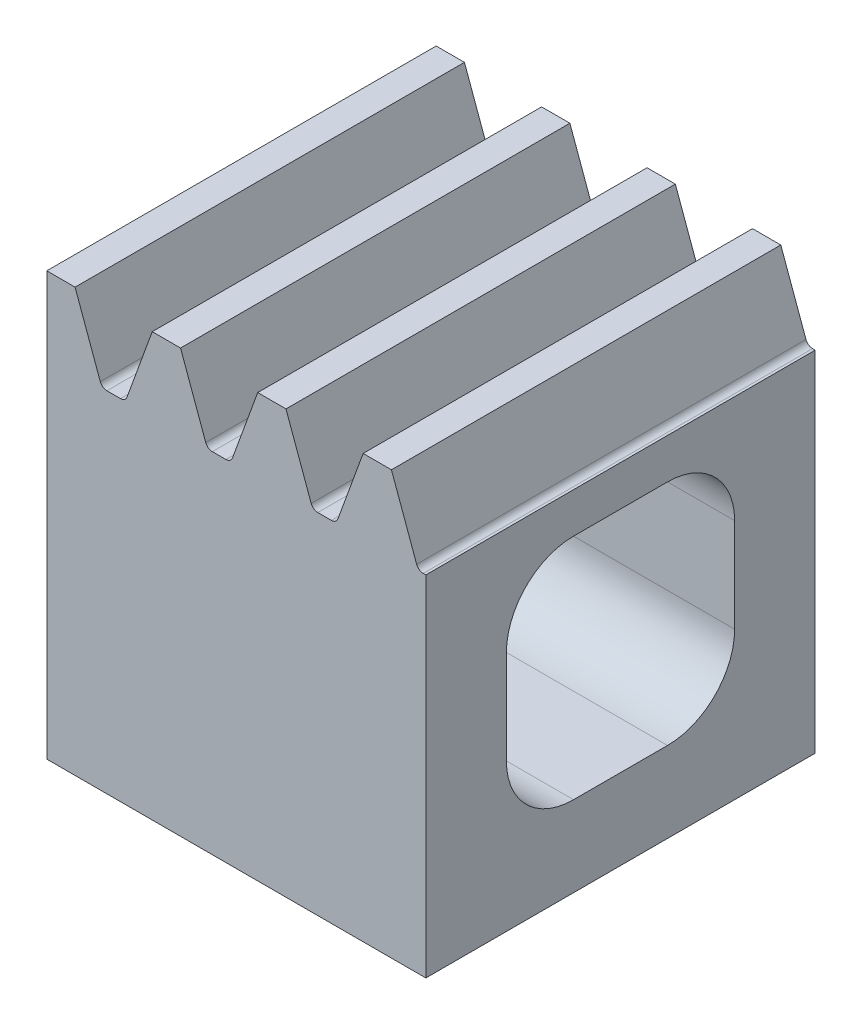
ISO-10303-21;
HEADER;
FILE_DESCRIPTION(('STEP AP214'),'2;1');
FILE_NAME('part.step','',(''),(''),'','','');
FILE_SCHEMA(('AUTOMOTIVE_DESIGN { 1 0 10303 214 1 1 1 1 }'));
ENDSEC;
DATA;
#1=APPLICATION_CONTEXT('core data for automotive mechanical design processes');
#2=APPLICATION_PROTOCOL_DEFINITION('international standard','automotive_design',2000,#1);
#3=PRODUCT_CONTEXT('',#1,'mechanical');
#4=PRODUCT('Part','Part','',(#3));
#5=PRODUCT_RELATED_PRODUCT_CATEGORY('part','',(#4));
#6=PRODUCT_DEFINITION_FORMATION('','',#4);
#7=PRODUCT_DEFINITION_CONTEXT('part definition',#1,'design');
#8=PRODUCT_DEFINITION('design','',#6,#7);
#9=PRODUCT_DEFINITION_SHAPE('','',#8);
#10=(LENGTH_UNIT() NAMED_UNIT(*) SI_UNIT(.MILLI.,.METRE.));
#11=(NAMED_UNIT(*) PLANE_ANGLE_UNIT() SI_UNIT($,.RADIAN.));
#12=(NAMED_UNIT(*) SI_UNIT($,.STERADIAN.) SOLID_ANGLE_UNIT());
#13=UNCERTAINTY_MEASURE_WITH_UNIT(LENGTH_MEASURE(1.E-05),#10,'distance_accuracy_value','');
#14=(GEOMETRIC_REPRESENTATION_CONTEXT(3) GLOBAL_UNCERTAINTY_ASSIGNED_CONTEXT((#13)) GLOBAL_UNIT_ASSIGNED_CONTEXT((#10,
#11,#12)) REPRESENTATION_CONTEXT('',''));
#15=CARTESIAN_POINT('',(0.,0.,0.));
#16=DIRECTION('',(0.,0.,1.));
#17=DIRECTION('',(1.,0.,0.));
#18=AXIS2_PLACEMENT_3D('',#15,#16,#17);
#19=CARTESIAN_POINT('',(125.,3.15,-2.));
#20=DIRECTION('',(0.,-1.,0.));
#21=DIRECTION('',(0.,0.,-1.));
#22=AXIS2_PLACEMENT_3D('',#19,#20,#21);
#23=PLANE('',#22);
#24=DIRECTION('',(0.,0.,1.));
#25=VECTOR('',#24,1.);
#26=CARTESIAN_POINT('',(-120.287615,3.15000000000001,-2.));
#27=LINE('',#26,#25);
#28=CARTESIAN_POINT('',(-120.287615,3.15000000000001,-2.));
#29=VERTEX_POINT('',#28);
#30=CARTESIAN_POINT('',(-120.287615,3.15000000000001,3.8));
#31=VERTEX_POINT('',#30);
#32=EDGE_CURVE('E511',#29,#31,#27,.T.);
#33=ORIENTED_EDGE('',*,*,#32,.T.);
#34=DIRECTION('',(-1.,0.,0.));
#35=VECTOR('',#34,1.);
#36=CARTESIAN_POINT('',(-119.866187734266,3.15000000000001,3.8));
#37=LINE('',#36,#35);
#38=CARTESIAN_POINT('',(-119.866187734266,3.15000000000001,3.8));
#39=VERTEX_POINT('',#38);
#40=EDGE_CURVE('E399',#39,#31,#37,.T.);
#41=ORIENTED_EDGE('',*,*,#40,.F.);
#42=DIRECTION('',(0.,0.,1.));
#43=VECTOR('',#42,1.);
#44=CARTESIAN_POINT('',(-119.866187734266,3.15000000000001,-2.));
#45=LINE('',#44,#43);
#46=CARTESIAN_POINT('',(-119.866187734266,3.15000000000001,-2.));
#47=VERTEX_POINT('',#46);
#48=EDGE_CURVE('E470',#47,#39,#45,.T.);
#49=ORIENTED_EDGE('',*,*,#48,.F.);
#50=DIRECTION('',(-1.,0.,0.));
#51=VECTOR('',#50,1.);
#52=CARTESIAN_POINT('',(125.,3.15,-2.));
#53=LINE('',#52,#51);
#54=EDGE_CURVE('E287',#47,#29,#53,.T.);
#55=ORIENTED_EDGE('',*,*,#54,.T.);
#56=EDGE_LOOP('',(#33,#41,#49,#55));
#57=FACE_BOUND('',#56,.T.);
#58=ADVANCED_FACE('F43',(#57),#23,.F.);
#59=DIRECTION('',(0.,0.,1.));
#60=VECTOR('',#59,1.);
#61=CARTESIAN_POINT('',(-121.85841,3.15000000000001,-2.));
#62=LINE('',#61,#60);
#63=CARTESIAN_POINT('',(-121.85841,3.15000000000001,-2.));
#64=VERTEX_POINT('',#63);
#65=CARTESIAN_POINT('',(-121.85841,3.15000000000001,3.8));
#66=VERTEX_POINT('',#65);
#67=EDGE_CURVE('E550',#64,#66,#62,.T.);
#68=ORIENTED_EDGE('',*,*,#67,.T.);
#69=DIRECTION('',(-1.,0.,0.));
#70=VECTOR('',#69,1.);
#71=CARTESIAN_POINT('',(-121.436982734266,3.15000000000001,3.8));
#72=LINE('',#71,#70);
#73=CARTESIAN_POINT('',(-121.436982734266,3.15000000000001,3.8));
#74=VERTEX_POINT('',#73);
#75=EDGE_CURVE('E417',#74,#66,#72,.T.);
#76=ORIENTED_EDGE('',*,*,#75,.F.);
#77=DIRECTION('',(0.,0.,1.));
#78=VECTOR('',#77,1.);
#79=CARTESIAN_POINT('',(-121.436982734266,3.15000000000001,-2.));
#80=LINE('',#79,#78);
#81=CARTESIAN_POINT('',(-121.436982734266,3.15000000000001,-2.));
#82=VERTEX_POINT('',#81);
#83=EDGE_CURVE('E490',#82,#74,#80,.T.);
#84=ORIENTED_EDGE('',*,*,#83,.F.);
#85=EDGE_CURVE('E295',#82,#64,#53,.T.);
#86=ORIENTED_EDGE('',*,*,#85,.T.);
#87=EDGE_LOOP('',(#68,#76,#84,#86));
#88=FACE_BOUND('',#87,.T.);
#89=ADVANCED_FACE('F663',(#88),#23,.F.);
#90=DIRECTION('',(0.,0.,1.));
#91=VECTOR('',#90,1.);
#92=CARTESIAN_POINT('',(-123.429205,3.15000000000001,-2.));
#93=LINE('',#92,#91);
#94=CARTESIAN_POINT('',(-123.429205,3.15000000000001,-2.));
#95=VERTEX_POINT('',#94);
#96=CARTESIAN_POINT('',(-123.429205,3.15000000000001,3.8));
#97=VERTEX_POINT('',#96);
#98=EDGE_CURVE('E566',#95,#97,#93,.T.);
#99=ORIENTED_EDGE('',*,*,#98,.T.);
#100=DIRECTION('',(-1.,0.,0.));
#101=VECTOR('',#100,1.);
#102=CARTESIAN_POINT('',(-123.007777734266,3.15000000000001,3.8));
#103=LINE('',#102,#101);
#104=CARTESIAN_POINT('',(-123.007777734266,3.15000000000001,3.8));
#105=VERTEX_POINT('',#104);
#106=EDGE_CURVE('E435',#105,#97,#103,.T.);
#107=ORIENTED_EDGE('',*,*,#106,.F.);
#108=DIRECTION('',(0.,0.,1.));
#109=VECTOR('',#108,1.);
#110=CARTESIAN_POINT('',(-123.007777734266,3.15000000000001,-2.));
#111=LINE('',#110,#109);
#112=CARTESIAN_POINT('',(-123.007777734266,3.15000000000001,-2.));
#113=VERTEX_POINT('',#112);
#114=EDGE_CURVE('E529',#113,#105,#111,.T.);
#115=ORIENTED_EDGE('',*,*,#114,.F.);
#116=EDGE_CURVE('E285',#113,#95,#53,.T.);
#117=ORIENTED_EDGE('',*,*,#116,.T.);
#118=EDGE_LOOP('',(#99,#107,#115,#117));
#119=FACE_BOUND('',#118,.T.);
#120=ADVANCED_FACE('F630',(#119),#23,.F.);
#121=CARTESIAN_POINT('',(125.,-3.15,-2.));
#122=DIRECTION('',(0.,0.,1.));
#123=DIRECTION('',(1.,0.,0.));
#124=AXIS2_PLACEMENT_3D('',#121,#122,#123);
#125=PLANE('',#124);
#126=DIRECTION('',(1.,0.,0.));
#127=VECTOR('',#126,1.);
#128=CARTESIAN_POINT('',(-119.465820476573,2.05,-2.));
#129=LINE('',#128,#127);
#130=CARTESIAN_POINT('',(-119.392585794194,2.05,-2.));
#131=VERTEX_POINT('',#130);
#132=CARTESIAN_POINT('',(-119.353616507946,2.05,-2.));
#133=VERTEX_POINT('',#132);
#134=EDGE_CURVE('E274',#131,#133,#129,.T.);
#135=ORIENTED_EDGE('',*,*,#134,.T.);
#136=DIRECTION('',(0.,1.,0.));
#137=VECTOR('',#136,1.);
#138=CARTESIAN_POINT('',(-119.353616507946,11.9079885195628,-2.));
#139=LINE('',#138,#137);
#140=CARTESIAN_POINT('',(-119.353616507946,-3.15,-2.));
#141=VERTEX_POINT('',#140);
#142=EDGE_CURVE('E258',#141,#133,#139,.T.);
#143=ORIENTED_EDGE('',*,*,#142,.F.);
#144=DIRECTION('',(-1.,0.,0.));
#145=VECTOR('',#144,1.);
#146=CARTESIAN_POINT('',(125.,-3.15,-2.));
#147=LINE('',#146,#145);
#148=CARTESIAN_POINT('',(-125.,-3.15,-2.));
#149=VERTEX_POINT('',#148);
#150=EDGE_CURVE('E270',#141,#149,#147,.T.);
#151=ORIENTED_EDGE('',*,*,#150,.T.);
#152=DIRECTION('',(0.,1.,0.));
#153=VECTOR('',#152,1.);
#154=CARTESIAN_POINT('',(-125.,-3.15,-2.));
#155=LINE('',#154,#153);
#156=CARTESIAN_POINT('',(-125.,3.15,-2.));
#157=VERTEX_POINT('',#156);
#158=EDGE_CURVE('E569',#149,#157,#155,.T.);
#159=ORIENTED_EDGE('',*,*,#158,.T.);
#160=CARTESIAN_POINT('',(-124.578572734266,3.15000000000001,-2.));
#161=VERTEX_POINT('',#160);
#162=EDGE_CURVE('E280',#161,#157,#53,.T.);
#163=ORIENTED_EDGE('',*,*,#162,.F.);
#164=DIRECTION('',(0.342020143325668,-0.939692620785909,0.));
#165=VECTOR('',#164,1.);
#166=CARTESIAN_POINT('',(-124.578572734266,3.15000000000001,-2.));
#167=LINE('',#166,#165);
#168=CARTESIAN_POINT('',(-124.203253213137,2.11881809061729,-2.));
#169=VERTEX_POINT('',#168);
#170=EDGE_CURVE('E553',#161,#169,#167,.T.);
#171=ORIENTED_EDGE('',*,*,#170,.T.);
#172=CARTESIAN_POINT('',(-124.104970794194,2.15458996566418,-2.));
#173=DIRECTION('',(0.,0.,1.));
#174=DIRECTION('',(1.,0.,0.));
#175=AXIS2_PLACEMENT_3D('',#172,#173,#174);
#176=CIRCLE('',#175,0.104589965664178);
#177=CARTESIAN_POINT('',(-124.104970794194,2.05,-2.));
#178=VERTEX_POINT('',#177);
#179=EDGE_CURVE('E310',#169,#178,#176,.T.);
#180=ORIENTED_EDGE('',*,*,#179,.T.);
#181=DIRECTION('',(1.,0.,0.));
#182=VECTOR('',#181,1.);
#183=CARTESIAN_POINT('',(-124.178205476573,2.05,-2.));
#184=LINE('',#183,#182);
#185=CARTESIAN_POINT('',(-123.902806940072,2.05,-2.));
#186=VERTEX_POINT('',#185);
#187=EDGE_CURVE('E557',#178,#186,#184,.T.);
#188=ORIENTED_EDGE('',*,*,#187,.T.);
#189=CARTESIAN_POINT('',(-123.902806940072,2.15458996566418,-2.));
#190=DIRECTION('',(0.,0.,1.));
#191=DIRECTION('',(1.,0.,0.));
#192=AXIS2_PLACEMENT_3D('',#189,#190,#191);
#193=CIRCLE('',#192,0.104589965664178);
#194=CARTESIAN_POINT('',(-123.804524521129,2.11881809061729,-2.));
#195=VERTEX_POINT('',#194);
#196=EDGE_CURVE('E307',#186,#195,#193,.T.);
#197=ORIENTED_EDGE('',*,*,#196,.T.);
#198=DIRECTION('',(0.342020143325668,0.939692620785909,0.));
#199=VECTOR('',#198,1.);
#200=CARTESIAN_POINT('',(-123.829572257693,2.05,-2.));
#201=LINE('',#200,#199);
#202=EDGE_CURVE('E561',#195,#95,#201,.T.);
#203=ORIENTED_EDGE('',*,*,#202,.T.);
#204=ORIENTED_EDGE('',*,*,#116,.F.);
#205=DIRECTION('',(0.342020143325668,-0.939692620785909,0.));
#206=VECTOR('',#205,1.);
#207=CARTESIAN_POINT('',(-123.007777734266,3.15000000000001,-2.));
#208=LINE('',#207,#206);
#209=CARTESIAN_POINT('',(-122.632458213137,2.11881809061729,-2.));
#210=VERTEX_POINT('',#209);
#211=EDGE_CURVE('E525',#113,#210,#208,.T.);
#212=ORIENTED_EDGE('',*,*,#211,.T.);
#213=CARTESIAN_POINT('',(-122.534175794194,2.15458996566418,-2.));
#214=DIRECTION('',(0.,0.,1.));
#215=DIRECTION('',(1.,0.,0.));
#216=AXIS2_PLACEMENT_3D('',#213,#214,#215);
#217=CIRCLE('',#216,0.104589965664178);
#218=CARTESIAN_POINT('',(-122.534175794194,2.05,-2.));
#219=VERTEX_POINT('',#218);
#220=EDGE_CURVE('E514',#210,#219,#217,.T.);
#221=ORIENTED_EDGE('',*,*,#220,.T.);
#222=DIRECTION('',(1.,0.,0.));
#223=VECTOR('',#222,1.);
#224=CARTESIAN_POINT('',(-122.607410476573,2.05,-2.));
#225=LINE('',#224,#223);
#226=CARTESIAN_POINT('',(-122.332011940072,2.05,-2.));
#227=VERTEX_POINT('',#226);
#228=EDGE_CURVE('E535',#219,#227,#225,.T.);
#229=ORIENTED_EDGE('',*,*,#228,.T.);
#230=CARTESIAN_POINT('',(-122.332011940072,2.15458996566418,-2.));
#231=DIRECTION('',(0.,0.,1.));
#232=DIRECTION('',(1.,0.,0.));
#233=AXIS2_PLACEMENT_3D('',#230,#231,#232);
#234=CIRCLE('',#233,0.104589965664178);
#235=CARTESIAN_POINT('',(-122.233729521129,2.11881809061729,-2.));
#236=VERTEX_POINT('',#235);
#237=EDGE_CURVE('E539',#227,#236,#234,.T.);
#238=ORIENTED_EDGE('',*,*,#237,.T.);
#239=DIRECTION('',(0.342020143325668,0.939692620785909,0.));
#240=VECTOR('',#239,1.);
#241=CARTESIAN_POINT('',(-122.258777257693,2.05,-2.));
#242=LINE('',#241,#240);
#243=EDGE_CURVE('E546',#236,#64,#242,.T.);
#244=ORIENTED_EDGE('',*,*,#243,.T.);
#245=ORIENTED_EDGE('',*,*,#85,.F.);
#246=DIRECTION('',(0.342020143325668,-0.939692620785909,0.));
#247=VECTOR('',#246,1.);
#248=CARTESIAN_POINT('',(-121.436982734266,3.15000000000001,-2.));
#249=LINE('',#248,#247);
#250=CARTESIAN_POINT('',(-121.061663213137,2.11881809061729,-2.));
#251=VERTEX_POINT('',#250);
#252=EDGE_CURVE('E486',#82,#251,#249,.T.);
#253=ORIENTED_EDGE('',*,*,#252,.T.);
#254=CARTESIAN_POINT('',(-120.963380794194,2.15458996566418,-2.));
#255=DIRECTION('',(0.,0.,1.));
#256=DIRECTION('',(1.,0.,0.));
#257=AXIS2_PLACEMENT_3D('',#254,#255,#256);
#258=CIRCLE('',#257,0.104589965664178);
#259=CARTESIAN_POINT('',(-120.963380794194,2.05,-2.));
#260=VERTEX_POINT('',#259);
#261=EDGE_CURVE('E475',#251,#260,#258,.T.);
#262=ORIENTED_EDGE('',*,*,#261,.T.);
#263=DIRECTION('',(1.,0.,0.));
#264=VECTOR('',#263,1.);
#265=CARTESIAN_POINT('',(-121.036615476573,2.05,-2.));
#266=LINE('',#265,#264);
#267=CARTESIAN_POINT('',(-120.761216940072,2.05,-2.));
#268=VERTEX_POINT('',#267);
#269=EDGE_CURVE('E496',#260,#268,#266,.T.);
#270=ORIENTED_EDGE('',*,*,#269,.T.);
#271=CARTESIAN_POINT('',(-120.761216940072,2.15458996566418,-2.));
#272=DIRECTION('',(0.,0.,1.));
#273=DIRECTION('',(1.,0.,0.));
#274=AXIS2_PLACEMENT_3D('',#271,#272,#273);
#275=CIRCLE('',#274,0.104589965664178);
#276=CARTESIAN_POINT('',(-120.662934521129,2.11881809061729,-2.));
#277=VERTEX_POINT('',#276);
#278=EDGE_CURVE('E500',#268,#277,#275,.T.);
#279=ORIENTED_EDGE('',*,*,#278,.T.);
#280=DIRECTION('',(0.342020143325668,0.939692620785909,0.));
#281=VECTOR('',#280,1.);
#282=CARTESIAN_POINT('',(-120.687982257693,2.05,-2.));
#283=LINE('',#282,#281);
#284=EDGE_CURVE('E507',#277,#29,#283,.T.);
#285=ORIENTED_EDGE('',*,*,#284,.T.);
#286=ORIENTED_EDGE('',*,*,#54,.F.);
#287=DIRECTION('',(0.342020143325668,-0.939692620785909,0.));
#288=VECTOR('',#287,1.);
#289=CARTESIAN_POINT('',(-119.866187734266,3.15000000000001,-2.));
#290=LINE('',#289,#288);
#291=CARTESIAN_POINT('',(-119.490868213137,2.11881809061729,-2.));
#292=VERTEX_POINT('',#291);
#293=EDGE_CURVE('E466',#47,#292,#290,.T.);
#294=ORIENTED_EDGE('',*,*,#293,.T.);
#295=CARTESIAN_POINT('',(-119.392585794194,2.15458996566418,-2.));
#296=DIRECTION('',(0.,0.,1.));
#297=DIRECTION('',(1.,0.,0.));
#298=AXIS2_PLACEMENT_3D('',#295,#296,#297);
#299=CIRCLE('',#298,0.104589965664178);
#300=EDGE_CURVE('E456',#292,#131,#299,.T.);
#301=ORIENTED_EDGE('',*,*,#300,.T.);
#302=EDGE_LOOP('',(#135,#143,#151,#159,#163,#171,#180,#188,#197,#203,#204,#212,#221,#229,#238,
#244,#245,#253,#262,#270,#279,#285,#286,#294,#301));
#303=FACE_BOUND('',#302,.T.);
#304=ADVANCED_FACE('F268',(#303),#125,.F.);
#305=DIRECTION('',(0.,0.,1.));
#306=VECTOR('',#305,1.);
#307=CARTESIAN_POINT('',(-125.,3.15,-2.));
#308=LINE('',#307,#306);
#309=CARTESIAN_POINT('',(-125.,3.15,3.8));
#310=VERTEX_POINT('',#309);
#311=EDGE_CURVE('E289',#157,#310,#308,.T.);
#312=ORIENTED_EDGE('',*,*,#311,.T.);
#313=DIRECTION('',(-1.,0.,0.));
#314=VECTOR('',#313,1.);
#315=CARTESIAN_POINT('',(-124.578572734266,3.15000000000001,3.8));
#316=LINE('',#315,#314);
#317=CARTESIAN_POINT('',(-124.578572734266,3.15000000000001,3.8));
#318=VERTEX_POINT('',#317);
#319=EDGE_CURVE('E453',#318,#310,#316,.T.);
#320=ORIENTED_EDGE('',*,*,#319,.F.);
#321=DIRECTION('',(0.,0.,1.));
#322=VECTOR('',#321,1.);
#323=CARTESIAN_POINT('',(-124.578572734266,3.15000000000001,-2.));
#324=LINE('',#323,#322);
#325=EDGE_CURVE('E565',#161,#318,#324,.T.);
#326=ORIENTED_EDGE('',*,*,#325,.F.);
#327=ORIENTED_EDGE('',*,*,#162,.T.);
#328=EDGE_LOOP('',(#312,#320,#326,#327));
#329=FACE_BOUND('',#328,.T.);
#330=ADVANCED_FACE('F578',(#329),#23,.F.);
#331=CARTESIAN_POINT('',(125.,-3.15,2.));
#332=DIRECTION('',(0.,1.,0.));
#333=DIRECTION('',(0.,0.,1.));
#334=AXIS2_PLACEMENT_3D('',#331,#332,#333);
#335=PLANE('',#334);
#336=ORIENTED_EDGE('',*,*,#150,.F.);
#337=DIRECTION('',(0.,0.,1.));
#338=VECTOR('',#337,1.);
#339=CARTESIAN_POINT('',(-119.353616507946,-3.15,2.));
#340=LINE('',#339,#338);
#341=CARTESIAN_POINT('',(-119.353616507946,-3.15,3.8));
#342=VERTEX_POINT('',#341);
#343=EDGE_CURVE('E255',#141,#342,#340,.T.);
#344=ORIENTED_EDGE('',*,*,#343,.T.);
#345=DIRECTION('',(1.,0.,0.));
#346=VECTOR('',#345,1.);
#347=CARTESIAN_POINT('',(-125.,-3.15,3.8));
#348=LINE('',#347,#346);
#349=CARTESIAN_POINT('',(-125.,-3.15,3.8));
#350=VERTEX_POINT('',#349);
#351=EDGE_CURVE('E389',#350,#342,#348,.T.);
#352=ORIENTED_EDGE('',*,*,#351,.F.);
#353=DIRECTION('',(0.,0.,-1.));
#354=VECTOR('',#353,1.);
#355=CARTESIAN_POINT('',(-125.,-3.15,2.));
#356=LINE('',#355,#354);
#357=EDGE_CURVE('E278',#350,#149,#356,.T.);
#358=ORIENTED_EDGE('',*,*,#357,.T.);
#359=EDGE_LOOP('',(#336,#344,#352,#358));
#360=FACE_BOUND('',#359,.T.);
#361=ADVANCED_FACE('F277',(#360),#335,.F.);
#362=CARTESIAN_POINT('',(-125.,0.,0.));
#363=DIRECTION('',(1.,0.,0.));
#364=DIRECTION('',(0.,0.,-1.));
#365=AXIS2_PLACEMENT_3D('',#362,#363,#364);
#366=PLANE('',#365);
#367=DIRECTION('',(0.,1.,0.));
#368=VECTOR('',#367,1.);
#369=CARTESIAN_POINT('',(-125.,1.45,2.6));
#370=LINE('',#369,#368);
#371=CARTESIAN_POINT('',(-125.,-0.949999999999998,2.6));
#372=VERTEX_POINT('',#371);
#373=CARTESIAN_POINT('',(-125.,0.450000000000001,2.6));
#374=VERTEX_POINT('',#373);
#375=EDGE_CURVE('E345',#372,#374,#370,.T.);
#376=ORIENTED_EDGE('',*,*,#375,.F.);
#377=CARTESIAN_POINT('',(-125.,-0.949999999999998,1.6));
#378=DIRECTION('',(1.,0.,0.));
#379=DIRECTION('',(0.,0.,-1.));
#380=AXIS2_PLACEMENT_3D('',#377,#378,#379);
#381=CIRCLE('',#380,1.);
#382=CARTESIAN_POINT('',(-125.,-1.95,1.6));
#383=VERTEX_POINT('',#382);
#384=EDGE_CURVE('E337',#372,#383,#381,.T.);
#385=ORIENTED_EDGE('',*,*,#384,.T.);
#386=DIRECTION('',(0.,0.,1.));
#387=VECTOR('',#386,1.);
#388=CARTESIAN_POINT('',(-125.,-1.95,2.6));
#389=LINE('',#388,#387);
#390=CARTESIAN_POINT('',(-125.,-1.95,0.200000000000001));
#391=VERTEX_POINT('',#390);
#392=EDGE_CURVE('E264',#391,#383,#389,.T.);
#393=ORIENTED_EDGE('',*,*,#392,.F.);
#394=CARTESIAN_POINT('',(-125.,-0.949999999999999,0.200000000000001));
#395=DIRECTION('',(1.,0.,0.));
#396=DIRECTION('',(0.,0.,-1.));
#397=AXIS2_PLACEMENT_3D('',#394,#395,#396);
#398=CIRCLE('',#397,1.);
#399=CARTESIAN_POINT('',(-125.,-0.949999999999999,-0.799999999999999));
#400=VERTEX_POINT('',#399);
#401=EDGE_CURVE('E333',#391,#400,#398,.T.);
#402=ORIENTED_EDGE('',*,*,#401,.T.);
#403=DIRECTION('',(0.,-1.,0.));
#404=VECTOR('',#403,1.);
#405=CARTESIAN_POINT('',(-125.,-1.95,-0.799999999999999));
#406=LINE('',#405,#404);
#407=CARTESIAN_POINT('',(-125.,0.450000000000001,-0.799999999999999));
#408=VERTEX_POINT('',#407);
#409=EDGE_CURVE('E383',#408,#400,#406,.T.);
#410=ORIENTED_EDGE('',*,*,#409,.F.);
#411=CARTESIAN_POINT('',(-125.,0.450000000000001,0.200000000000001));
#412=DIRECTION('',(1.,0.,0.));
#413=DIRECTION('',(0.,0.,-1.));
#414=AXIS2_PLACEMENT_3D('',#411,#412,#413);
#415=CIRCLE('',#414,1.);
#416=CARTESIAN_POINT('',(-125.,1.45,0.200000000000001));
#417=VERTEX_POINT('',#416);
#418=EDGE_CURVE('E335',#408,#417,#415,.T.);
#419=ORIENTED_EDGE('',*,*,#418,.T.);
#420=DIRECTION('',(0.,0.,-1.));
#421=VECTOR('',#420,1.);
#422=CARTESIAN_POINT('',(-125.,1.45,-0.799999999999999));
#423=LINE('',#422,#421);
#424=CARTESIAN_POINT('',(-125.,1.45,1.6));
#425=VERTEX_POINT('',#424);
#426=EDGE_CURVE('E347',#425,#417,#423,.T.);
#427=ORIENTED_EDGE('',*,*,#426,.F.);
#428=CARTESIAN_POINT('',(-125.,0.450000000000001,1.6));
#429=DIRECTION('',(1.,0.,0.));
#430=DIRECTION('',(0.,0.,-1.));
#431=AXIS2_PLACEMENT_3D('',#428,#429,#430);
#432=CIRCLE('',#431,1.);
#433=EDGE_CURVE('E51',#425,#374,#432,.T.);
#434=ORIENTED_EDGE('',*,*,#433,.T.);
#435=EDGE_LOOP('',(#376,#385,#393,#402,#410,#419,#427,#434));
#436=FACE_BOUND('',#435,.T.);
#437=ORIENTED_EDGE('',*,*,#158,.F.);
#438=ORIENTED_EDGE('',*,*,#357,.F.);
#439=DIRECTION('',(0.,-1.,0.));
#440=VECTOR('',#439,1.);
#441=CARTESIAN_POINT('',(-125.,3.15,3.8));
#442=LINE('',#441,#440);
#443=EDGE_CURVE('E386',#310,#350,#442,.T.);
#444=ORIENTED_EDGE('',*,*,#443,.F.);
#445=ORIENTED_EDGE('',*,*,#311,.F.);
#446=EDGE_LOOP('',(#437,#438,#444,#445));
#447=FACE_BOUND('',#446,.T.);
#448=ADVANCED_FACE('F343',(#436,#447),#366,.F.);
#449=CARTESIAN_POINT('',(-123.829572257693,2.05,-2.));
#450=DIRECTION('',(0.939692620785909,-0.342020143325668,0.));
#451=DIRECTION('',(0.342020143325668,0.939692620785909,0.));
#452=AXIS2_PLACEMENT_3D('',#449,#450,#451);
#453=PLANE('',#452);
#454=ORIENTED_EDGE('',*,*,#202,.F.);
#455=DIRECTION('',(0.,0.,1.));
#456=VECTOR('',#455,1.);
#457=CARTESIAN_POINT('',(-123.804524521129,2.11881809061729,2.));
#458=LINE('',#457,#456);
#459=CARTESIAN_POINT('',(-123.804524521129,2.11881809061729,3.8));
#460=VERTEX_POINT('',#459);
#461=EDGE_CURVE('E294',#195,#460,#458,.T.);
#462=ORIENTED_EDGE('',*,*,#461,.T.);
#463=DIRECTION('',(-0.342020143325668,-0.939692620785909,0.));
#464=VECTOR('',#463,1.);
#465=CARTESIAN_POINT('',(-123.429205,3.15000000000001,3.8));
#466=LINE('',#465,#464);
#467=EDGE_CURVE('E438',#97,#460,#466,.T.);
#468=ORIENTED_EDGE('',*,*,#467,.F.);
#469=ORIENTED_EDGE('',*,*,#98,.F.);
#470=EDGE_LOOP('',(#454,#462,#468,#469));
#471=FACE_BOUND('',#470,.T.);
#472=ADVANCED_FACE('F638',(#471),#453,.F.);
#473=CARTESIAN_POINT('',(-124.178205476573,2.05,-2.));
#474=DIRECTION('',(0.,-1.,0.));
#475=DIRECTION('',(0.,0.,-1.));
#476=AXIS2_PLACEMENT_3D('',#473,#474,#475);
#477=PLANE('',#476);
#478=DIRECTION('',(0.,0.,1.));
#479=VECTOR('',#478,1.);
#480=CARTESIAN_POINT('',(-124.104970794194,2.05,2.));
#481=LINE('',#480,#479);
#482=CARTESIAN_POINT('',(-124.104970794194,2.05,3.8));
#483=VERTEX_POINT('',#482);
#484=EDGE_CURVE('E298',#178,#483,#481,.T.);
#485=ORIENTED_EDGE('',*,*,#484,.T.);
#486=DIRECTION('',(-1.,0.,0.));
#487=VECTOR('',#486,1.);
#488=CARTESIAN_POINT('',(-123.902806940072,2.05,3.8));
#489=LINE('',#488,#487);
#490=CARTESIAN_POINT('',(-123.902806940072,2.05,3.8));
#491=VERTEX_POINT('',#490);
#492=EDGE_CURVE('E444',#491,#483,#489,.T.);
#493=ORIENTED_EDGE('',*,*,#492,.F.);
#494=DIRECTION('',(0.,0.,1.));
#495=VECTOR('',#494,1.);
#496=CARTESIAN_POINT('',(-123.902806940072,2.05,-2.));
#497=LINE('',#496,#495);
#498=EDGE_CURVE('E301',#491,#186,#497,.F.);
#499=ORIENTED_EDGE('',*,*,#498,.T.);
#500=ORIENTED_EDGE('',*,*,#187,.F.);
#501=EDGE_LOOP('',(#485,#493,#499,#500));
#502=FACE_BOUND('',#501,.T.);
#503=ADVANCED_FACE('F645',(#502),#477,.F.);
#504=CARTESIAN_POINT('',(-124.578572734266,3.15000000000001,-2.));
#505=DIRECTION('',(-0.939692620785909,-0.342020143325668,0.));
#506=DIRECTION('',(0.342020143325668,-0.939692620785909,0.));
#507=AXIS2_PLACEMENT_3D('',#504,#505,#506);
#508=PLANE('',#507);
#509=ORIENTED_EDGE('',*,*,#325,.T.);
#510=DIRECTION('',(-0.342020143325635,0.939692620785921,0.));
#511=VECTOR('',#510,1.);
#512=CARTESIAN_POINT('',(-124.203253213137,2.11881809061729,3.8));
#513=LINE('',#512,#511);
#514=CARTESIAN_POINT('',(-124.203253213137,2.11881809061729,3.8));
#515=VERTEX_POINT('',#514);
#516=EDGE_CURVE('E450',#515,#318,#513,.T.);
#517=ORIENTED_EDGE('',*,*,#516,.F.);
#518=DIRECTION('',(0.,0.,1.));
#519=VECTOR('',#518,1.);
#520=CARTESIAN_POINT('',(-124.203253213137,2.11881809061729,-2.));
#521=LINE('',#520,#519);
#522=EDGE_CURVE('E304',#515,#169,#521,.F.);
#523=ORIENTED_EDGE('',*,*,#522,.T.);
#524=ORIENTED_EDGE('',*,*,#170,.F.);
#525=EDGE_LOOP('',(#509,#517,#523,#524));
#526=FACE_BOUND('',#525,.T.);
#527=ADVANCED_FACE('F652',(#526),#508,.F.);
#528=CARTESIAN_POINT('',(-123.902806940072,2.15458996566418,-2.));
#529=DIRECTION('',(0.,0.,-1.));
#530=DIRECTION('',(-1.,0.,0.));
#531=AXIS2_PLACEMENT_3D('',#528,#529,#530);
#532=CYLINDRICAL_SURFACE('',#531,0.104589965664178);
#533=ORIENTED_EDGE('',*,*,#196,.F.);
#534=ORIENTED_EDGE('',*,*,#498,.F.);
#535=CARTESIAN_POINT('',(-123.902806940072,2.15458996566418,3.8));
#536=DIRECTION('',(0.,0.,-1.));
#537=DIRECTION('',(1.,0.,0.));
#538=AXIS2_PLACEMENT_3D('',#535,#536,#537);
#539=CIRCLE('',#538,0.104589965664183);
#540=EDGE_CURVE('E441',#460,#491,#539,.T.);
#541=ORIENTED_EDGE('',*,*,#540,.F.);
#542=ORIENTED_EDGE('',*,*,#461,.F.);
#543=EDGE_LOOP('',(#533,#534,#541,#542));
#544=FACE_BOUND('',#543,.T.);
#545=ADVANCED_FACE('F642',(#544),#532,.F.);
#546=CARTESIAN_POINT('',(-124.104970794194,2.15458996566418,-2.));
#547=DIRECTION('',(0.,0.,-1.));
#548=DIRECTION('',(-1.,0.,0.));
#549=AXIS2_PLACEMENT_3D('',#546,#547,#548);
#550=CYLINDRICAL_SURFACE('',#549,0.104589965664178);
#551=ORIENTED_EDGE('',*,*,#179,.F.);
#552=ORIENTED_EDGE('',*,*,#522,.F.);
#553=CARTESIAN_POINT('',(-124.104970794194,2.15458996566418,3.8));
#554=DIRECTION('',(0.,0.,-1.));
#555=DIRECTION('',(1.,0.,0.));
#556=AXIS2_PLACEMENT_3D('',#553,#554,#555);
#557=CIRCLE('',#556,0.104589965664181);
#558=EDGE_CURVE('E447',#483,#515,#557,.T.);
#559=ORIENTED_EDGE('',*,*,#558,.F.);
#560=ORIENTED_EDGE('',*,*,#484,.F.);
#561=EDGE_LOOP('',(#551,#552,#559,#560));
#562=FACE_BOUND('',#561,.T.);
#563=ADVANCED_FACE('F649',(#562),#550,.F.);
#564=CARTESIAN_POINT('',(-122.258777257693,2.05,-2.));
#565=DIRECTION('',(0.939692620785909,-0.342020143325668,0.));
#566=DIRECTION('',(0.342020143325668,0.939692620785909,0.));
#567=AXIS2_PLACEMENT_3D('',#564,#565,#566);
#568=PLANE('',#567);
#569=ORIENTED_EDGE('',*,*,#243,.F.);
#570=DIRECTION('',(0.,0.,1.));
#571=VECTOR('',#570,1.);
#572=CARTESIAN_POINT('',(-122.233729521129,2.11881809061729,2.));
#573=LINE('',#572,#571);
#574=CARTESIAN_POINT('',(-122.233729521129,2.11881809061729,3.8));
#575=VERTEX_POINT('',#574);
#576=EDGE_CURVE('E543',#236,#575,#573,.T.);
#577=ORIENTED_EDGE('',*,*,#576,.T.);
#578=DIRECTION('',(-0.342020143325668,-0.939692620785909,0.));
#579=VECTOR('',#578,1.);
#580=CARTESIAN_POINT('',(-121.85841,3.15000000000001,3.8));
#581=LINE('',#580,#579);
#582=EDGE_CURVE('E420',#66,#575,#581,.T.);
#583=ORIENTED_EDGE('',*,*,#582,.F.);
#584=ORIENTED_EDGE('',*,*,#67,.F.);
#585=EDGE_LOOP('',(#569,#577,#583,#584));
#586=FACE_BOUND('',#585,.T.);
#587=ADVANCED_FACE('F796',(#586),#568,.F.);
#588=CARTESIAN_POINT('',(-122.332011940072,2.15458996566418,-2.));
#589=DIRECTION('',(0.,0.,-1.));
#590=DIRECTION('',(-1.,0.,0.));
#591=AXIS2_PLACEMENT_3D('',#588,#589,#590);
#592=CYLINDRICAL_SURFACE('',#591,0.104589965664178);
#593=ORIENTED_EDGE('',*,*,#237,.F.);
#594=DIRECTION('',(0.,0.,1.));
#595=VECTOR('',#594,1.);
#596=CARTESIAN_POINT('',(-122.332011940072,2.05,-2.));
#597=LINE('',#596,#595);
#598=CARTESIAN_POINT('',(-122.332011940072,2.05,3.8));
#599=VERTEX_POINT('',#598);
#600=EDGE_CURVE('E532',#599,#227,#597,.F.);
#601=ORIENTED_EDGE('',*,*,#600,.F.);
#602=CARTESIAN_POINT('',(-122.332011940072,2.15458996566418,3.8));
#603=DIRECTION('',(0.,0.,-1.));
#604=DIRECTION('',(1.,0.,0.));
#605=AXIS2_PLACEMENT_3D('',#602,#603,#604);
#606=CIRCLE('',#605,0.104589965664183);
#607=EDGE_CURVE('E423',#575,#599,#606,.T.);
#608=ORIENTED_EDGE('',*,*,#607,.F.);
#609=ORIENTED_EDGE('',*,*,#576,.F.);
#610=EDGE_LOOP('',(#593,#601,#608,#609));
#611=FACE_BOUND('',#610,.T.);
#612=ADVANCED_FACE('F786',(#611),#592,.F.);
#613=CARTESIAN_POINT('',(-122.607410476573,2.05,-2.));
#614=DIRECTION('',(0.,-1.,0.));
#615=DIRECTION('',(0.,0.,-1.));
#616=AXIS2_PLACEMENT_3D('',#613,#614,#615);
#617=PLANE('',#616);
#618=DIRECTION('',(0.,0.,1.));
#619=VECTOR('',#618,1.);
#620=CARTESIAN_POINT('',(-122.534175794194,2.05,2.));
#621=LINE('',#620,#619);
#622=CARTESIAN_POINT('',(-122.534175794194,2.05,3.8));
#623=VERTEX_POINT('',#622);
#624=EDGE_CURVE('E522',#219,#623,#621,.T.);
#625=ORIENTED_EDGE('',*,*,#624,.T.);
#626=DIRECTION('',(-1.,0.,0.));
#627=VECTOR('',#626,1.);
#628=CARTESIAN_POINT('',(-122.332011940072,2.05,3.8));
#629=LINE('',#628,#627);
#630=EDGE_CURVE('E426',#599,#623,#629,.T.);
#631=ORIENTED_EDGE('',*,*,#630,.F.);
#632=ORIENTED_EDGE('',*,*,#600,.T.);
#633=ORIENTED_EDGE('',*,*,#228,.F.);
#634=EDGE_LOOP('',(#625,#631,#632,#633));
#635=FACE_BOUND('',#634,.T.);
#636=ADVANCED_FACE('F776',(#635),#617,.F.);
#637=CARTESIAN_POINT('',(-123.007777734266,3.15000000000001,-2.));
#638=DIRECTION('',(-0.939692620785909,-0.342020143325668,0.));
#639=DIRECTION('',(0.342020143325668,-0.939692620785909,0.));
#640=AXIS2_PLACEMENT_3D('',#637,#638,#639);
#641=PLANE('',#640);
#642=ORIENTED_EDGE('',*,*,#114,.T.);
#643=DIRECTION('',(-0.342020143325636,0.93969262078592,0.));
#644=VECTOR('',#643,1.);
#645=CARTESIAN_POINT('',(-122.632458213137,2.11881809061729,3.8));
#646=LINE('',#645,#644);
#647=CARTESIAN_POINT('',(-122.632458213137,2.11881809061729,3.8));
#648=VERTEX_POINT('',#647);
#649=EDGE_CURVE('E432',#648,#105,#646,.T.);
#650=ORIENTED_EDGE('',*,*,#649,.F.);
#651=DIRECTION('',(0.,0.,1.));
#652=VECTOR('',#651,1.);
#653=CARTESIAN_POINT('',(-122.632458213137,2.11881809061729,-2.));
#654=LINE('',#653,#652);
#655=EDGE_CURVE('E518',#648,#210,#654,.F.);
#656=ORIENTED_EDGE('',*,*,#655,.T.);
#657=ORIENTED_EDGE('',*,*,#211,.F.);
#658=EDGE_LOOP('',(#642,#650,#656,#657));
#659=FACE_BOUND('',#658,.T.);
#660=ADVANCED_FACE('F766',(#659),#641,.F.);
#661=CARTESIAN_POINT('',(-122.534175794194,2.15458996566418,-2.));
#662=DIRECTION('',(0.,0.,-1.));
#663=DIRECTION('',(-1.,0.,0.));
#664=AXIS2_PLACEMENT_3D('',#661,#662,#663);
#665=CYLINDRICAL_SURFACE('',#664,0.104589965664178);
#666=ORIENTED_EDGE('',*,*,#220,.F.);
#667=ORIENTED_EDGE('',*,*,#655,.F.);
#668=CARTESIAN_POINT('',(-122.534175794194,2.15458996566418,3.8));
#669=DIRECTION('',(0.,0.,-1.));
#670=DIRECTION('',(1.,0.,0.));
#671=AXIS2_PLACEMENT_3D('',#668,#669,#670);
#672=CIRCLE('',#671,0.10458996566418);
#673=EDGE_CURVE('E429',#623,#648,#672,.T.);
#674=ORIENTED_EDGE('',*,*,#673,.F.);
#675=ORIENTED_EDGE('',*,*,#624,.F.);
#676=EDGE_LOOP('',(#666,#667,#674,#675));
#677=FACE_BOUND('',#676,.T.);
#678=ADVANCED_FACE('F757',(#677),#665,.F.);
#679=CARTESIAN_POINT('',(-120.687982257693,2.05,-2.));
#680=DIRECTION('',(0.939692620785909,-0.342020143325668,0.));
#681=DIRECTION('',(0.342020143325668,0.939692620785909,0.));
#682=AXIS2_PLACEMENT_3D('',#679,#680,#681);
#683=PLANE('',#682);
#684=ORIENTED_EDGE('',*,*,#284,.F.);
#685=DIRECTION('',(0.,0.,1.));
#686=VECTOR('',#685,1.);
#687=CARTESIAN_POINT('',(-120.662934521129,2.11881809061729,2.));
#688=LINE('',#687,#686);
#689=CARTESIAN_POINT('',(-120.662934521129,2.11881809061729,3.8));
#690=VERTEX_POINT('',#689);
#691=EDGE_CURVE('E504',#277,#690,#688,.T.);
#692=ORIENTED_EDGE('',*,*,#691,.T.);
#693=DIRECTION('',(-0.342020143325668,-0.939692620785909,0.));
#694=VECTOR('',#693,1.);
#695=CARTESIAN_POINT('',(-120.287615,3.15000000000001,3.8));
#696=LINE('',#695,#694);
#697=EDGE_CURVE('E402',#31,#690,#696,.T.);
#698=ORIENTED_EDGE('',*,*,#697,.F.);
#699=ORIENTED_EDGE('',*,*,#32,.F.);
#700=EDGE_LOOP('',(#684,#692,#698,#699));
#701=FACE_BOUND('',#700,.T.);
#702=ADVANCED_FACE('F603',(#701),#683,.F.);
#703=CARTESIAN_POINT('',(-120.761216940072,2.15458996566418,-2.));
#704=DIRECTION('',(0.,0.,-1.));
#705=DIRECTION('',(-1.,0.,0.));
#706=AXIS2_PLACEMENT_3D('',#703,#704,#705);
#707=CYLINDRICAL_SURFACE('',#706,0.104589965664178);
#708=ORIENTED_EDGE('',*,*,#278,.F.);
#709=DIRECTION('',(0.,0.,1.));
#710=VECTOR('',#709,1.);
#711=CARTESIAN_POINT('',(-120.761216940072,2.05,-2.));
#712=LINE('',#711,#710);
#713=CARTESIAN_POINT('',(-120.761216940072,2.05,3.8));
#714=VERTEX_POINT('',#713);
#715=EDGE_CURVE('E493',#714,#268,#712,.F.);
#716=ORIENTED_EDGE('',*,*,#715,.F.);
#717=CARTESIAN_POINT('',(-120.761216940072,2.15458996566418,3.8));
#718=DIRECTION('',(0.,0.,-1.));
#719=DIRECTION('',(1.,0.,0.));
#720=AXIS2_PLACEMENT_3D('',#717,#718,#719);
#721=CIRCLE('',#720,0.104589965664183);
#722=EDGE_CURVE('E405',#690,#714,#721,.T.);
#723=ORIENTED_EDGE('',*,*,#722,.F.);
#724=ORIENTED_EDGE('',*,*,#691,.F.);
#725=EDGE_LOOP('',(#708,#716,#723,#724));
#726=FACE_BOUND('',#725,.T.);
#727=ADVANCED_FACE('F608',(#726),#707,.F.);
#728=CARTESIAN_POINT('',(-121.036615476573,2.05,-2.));
#729=DIRECTION('',(0.,-1.,0.));
#730=DIRECTION('',(0.,0.,-1.));
#731=AXIS2_PLACEMENT_3D('',#728,#729,#730);
#732=PLANE('',#731);
#733=DIRECTION('',(0.,0.,1.));
#734=VECTOR('',#733,1.);
#735=CARTESIAN_POINT('',(-120.963380794194,2.05,2.));
#736=LINE('',#735,#734);
#737=CARTESIAN_POINT('',(-120.963380794194,2.05,3.8));
#738=VERTEX_POINT('',#737);
#739=EDGE_CURVE('E483',#260,#738,#736,.T.);
#740=ORIENTED_EDGE('',*,*,#739,.T.);
#741=DIRECTION('',(-1.,0.,0.));
#742=VECTOR('',#741,1.);
#743=CARTESIAN_POINT('',(-120.761216940072,2.05,3.8));
#744=LINE('',#743,#742);
#745=EDGE_CURVE('E408',#714,#738,#744,.T.);
#746=ORIENTED_EDGE('',*,*,#745,.F.);
#747=ORIENTED_EDGE('',*,*,#715,.T.);
#748=ORIENTED_EDGE('',*,*,#269,.F.);
#749=EDGE_LOOP('',(#740,#746,#747,#748));
#750=FACE_BOUND('',#749,.T.);
#751=ADVANCED_FACE('F611',(#750),#732,.F.);
#752=CARTESIAN_POINT('',(-121.436982734266,3.15000000000001,-2.));
#753=DIRECTION('',(-0.939692620785909,-0.342020143325668,0.));
#754=DIRECTION('',(0.342020143325668,-0.939692620785909,0.));
#755=AXIS2_PLACEMENT_3D('',#752,#753,#754);
#756=PLANE('',#755);
#757=ORIENTED_EDGE('',*,*,#83,.T.);
#758=DIRECTION('',(-0.342020143325636,0.93969262078592,0.));
#759=VECTOR('',#758,1.);
#760=CARTESIAN_POINT('',(-121.061663213137,2.11881809061729,3.8));
#761=LINE('',#760,#759);
#762=CARTESIAN_POINT('',(-121.061663213137,2.11881809061729,3.8));
#763=VERTEX_POINT('',#762);
#764=EDGE_CURVE('E414',#763,#74,#761,.T.);
#765=ORIENTED_EDGE('',*,*,#764,.F.);
#766=DIRECTION('',(0.,0.,1.));
#767=VECTOR('',#766,1.);
#768=CARTESIAN_POINT('',(-121.061663213137,2.11881809061729,-2.));
#769=LINE('',#768,#767);
#770=EDGE_CURVE('E479',#763,#251,#769,.F.);
#771=ORIENTED_EDGE('',*,*,#770,.T.);
#772=ORIENTED_EDGE('',*,*,#252,.F.);
#773=EDGE_LOOP('',(#757,#765,#771,#772));
#774=FACE_BOUND('',#773,.T.);
#775=ADVANCED_FACE('F617',(#774),#756,.F.);
#776=CARTESIAN_POINT('',(-120.963380794194,2.15458996566418,-2.));
#777=DIRECTION('',(0.,0.,-1.));
#778=DIRECTION('',(-1.,0.,0.));
#779=AXIS2_PLACEMENT_3D('',#776,#777,#778);
#780=CYLINDRICAL_SURFACE('',#779,0.104589965664178);
#781=ORIENTED_EDGE('',*,*,#261,.F.);
#782=ORIENTED_EDGE('',*,*,#770,.F.);
#783=CARTESIAN_POINT('',(-120.963380794194,2.15458996566418,3.8));
#784=DIRECTION('',(0.,0.,-1.));
#785=DIRECTION('',(1.,0.,0.));
#786=AXIS2_PLACEMENT_3D('',#783,#784,#785);
#787=CIRCLE('',#786,0.10458996566418);
#788=EDGE_CURVE('E411',#738,#763,#787,.T.);
#789=ORIENTED_EDGE('',*,*,#788,.F.);
#790=ORIENTED_EDGE('',*,*,#739,.F.);
#791=EDGE_LOOP('',(#781,#782,#789,#790));
#792=FACE_BOUND('',#791,.T.);
#793=ADVANCED_FACE('F615',(#792),#780,.F.);
#794=CARTESIAN_POINT('',(-119.465820476573,2.05,-2.));
#795=DIRECTION('',(0.,-1.,0.));
#796=DIRECTION('',(0.,0.,-1.));
#797=AXIS2_PLACEMENT_3D('',#794,#795,#796);
#798=PLANE('',#797);
#799=DIRECTION('',(-1.,0.,0.));
#800=VECTOR('',#799,1.);
#801=CARTESIAN_POINT('',(-119.190421940072,2.05,3.8));
#802=LINE('',#801,#800);
#803=CARTESIAN_POINT('',(-119.353616507946,2.05,3.8));
#804=VERTEX_POINT('',#803);
#805=CARTESIAN_POINT('',(-119.392585794194,2.05,3.8));
#806=VERTEX_POINT('',#805);
#807=EDGE_CURVE('E391',#804,#806,#802,.T.);
#808=ORIENTED_EDGE('',*,*,#807,.F.);
#809=DIRECTION('',(0.,0.,-1.));
#810=VECTOR('',#809,1.);
#811=CARTESIAN_POINT('',(-119.353616507946,2.05,-2.));
#812=LINE('',#811,#810);
#813=EDGE_CURVE('E58',#804,#133,#812,.T.);
#814=ORIENTED_EDGE('',*,*,#813,.T.);
#815=ORIENTED_EDGE('',*,*,#134,.F.);
#816=DIRECTION('',(0.,0.,1.));
#817=VECTOR('',#816,1.);
#818=CARTESIAN_POINT('',(-119.392585794194,2.05,2.));
#819=LINE('',#818,#817);
#820=EDGE_CURVE('E462',#131,#806,#819,.T.);
#821=ORIENTED_EDGE('',*,*,#820,.T.);
#822=EDGE_LOOP('',(#808,#814,#815,#821));
#823=FACE_BOUND('',#822,.T.);
#824=ADVANCED_FACE('F588',(#823),#798,.F.);
#825=CARTESIAN_POINT('',(-119.866187734266,3.15000000000001,-2.));
#826=DIRECTION('',(-0.939692620785909,-0.342020143325668,0.));
#827=DIRECTION('',(0.342020143325668,-0.939692620785909,0.));
#828=AXIS2_PLACEMENT_3D('',#825,#826,#827);
#829=PLANE('',#828);
#830=ORIENTED_EDGE('',*,*,#48,.T.);
#831=DIRECTION('',(-0.342020143325636,0.93969262078592,0.));
#832=VECTOR('',#831,1.);
#833=CARTESIAN_POINT('',(-119.490868213137,2.11881809061729,3.8));
#834=LINE('',#833,#832);
#835=CARTESIAN_POINT('',(-119.490868213137,2.11881809061729,3.8));
#836=VERTEX_POINT('',#835);
#837=EDGE_CURVE('E396',#836,#39,#834,.T.);
#838=ORIENTED_EDGE('',*,*,#837,.F.);
#839=DIRECTION('',(0.,0.,1.));
#840=VECTOR('',#839,1.);
#841=CARTESIAN_POINT('',(-119.490868213137,2.11881809061729,-2.));
#842=LINE('',#841,#840);
#843=EDGE_CURVE('E458',#836,#292,#842,.F.);
#844=ORIENTED_EDGE('',*,*,#843,.T.);
#845=ORIENTED_EDGE('',*,*,#293,.F.);
#846=EDGE_LOOP('',(#830,#838,#844,#845));
#847=FACE_BOUND('',#846,.T.);
#848=ADVANCED_FACE('F595',(#847),#829,.F.);
#849=CARTESIAN_POINT('',(-119.392585794194,2.15458996566418,-2.));
#850=DIRECTION('',(0.,0.,-1.));
#851=DIRECTION('',(-1.,0.,0.));
#852=AXIS2_PLACEMENT_3D('',#849,#850,#851);
#853=CYLINDRICAL_SURFACE('',#852,0.104589965664178);
#854=ORIENTED_EDGE('',*,*,#300,.F.);
#855=ORIENTED_EDGE('',*,*,#843,.F.);
#856=CARTESIAN_POINT('',(-119.392585794194,2.15458996566418,3.8));
#857=DIRECTION('',(0.,0.,-1.));
#858=DIRECTION('',(1.,0.,0.));
#859=AXIS2_PLACEMENT_3D('',#856,#857,#858);
#860=CIRCLE('',#859,0.10458996566418);
#861=EDGE_CURVE('E393',#806,#836,#860,.T.);
#862=ORIENTED_EDGE('',*,*,#861,.F.);
#863=ORIENTED_EDGE('',*,*,#820,.F.);
#864=EDGE_LOOP('',(#854,#855,#862,#863));
#865=FACE_BOUND('',#864,.T.);
#866=ADVANCED_FACE('F591',(#865),#853,.F.);
#867=CARTESIAN_POINT('',(-25.1448857941942,2.15458996566418,3.8));
#868=DIRECTION('',(0.,0.,1.));
#869=DIRECTION('',(1.,0.,0.));
#870=AXIS2_PLACEMENT_3D('',#867,#868,#869);
#871=PLANE('',#870);
#872=DIRECTION('',(0.,1.,0.));
#873=VECTOR('',#872,1.);
#874=CARTESIAN_POINT('',(-119.353616507946,11.9079885195628,3.8));
#875=LINE('',#874,#873);
#876=EDGE_CURVE('E259',#342,#804,#875,.T.);
#877=ORIENTED_EDGE('',*,*,#876,.T.);
#878=ORIENTED_EDGE('',*,*,#807,.T.);
#879=ORIENTED_EDGE('',*,*,#861,.T.);
#880=ORIENTED_EDGE('',*,*,#837,.T.);
#881=ORIENTED_EDGE('',*,*,#40,.T.);
#882=ORIENTED_EDGE('',*,*,#697,.T.);
#883=ORIENTED_EDGE('',*,*,#722,.T.);
#884=ORIENTED_EDGE('',*,*,#745,.T.);
#885=ORIENTED_EDGE('',*,*,#788,.T.);
#886=ORIENTED_EDGE('',*,*,#764,.T.);
#887=ORIENTED_EDGE('',*,*,#75,.T.);
#888=ORIENTED_EDGE('',*,*,#582,.T.);
#889=ORIENTED_EDGE('',*,*,#607,.T.);
#890=ORIENTED_EDGE('',*,*,#630,.T.);
#891=ORIENTED_EDGE('',*,*,#673,.T.);
#892=ORIENTED_EDGE('',*,*,#649,.T.);
#893=ORIENTED_EDGE('',*,*,#106,.T.);
#894=ORIENTED_EDGE('',*,*,#467,.T.);
#895=ORIENTED_EDGE('',*,*,#540,.T.);
#896=ORIENTED_EDGE('',*,*,#492,.T.);
#897=ORIENTED_EDGE('',*,*,#558,.T.);
#898=ORIENTED_EDGE('',*,*,#516,.T.);
#899=ORIENTED_EDGE('',*,*,#319,.T.);
#900=ORIENTED_EDGE('',*,*,#443,.T.);
#901=ORIENTED_EDGE('',*,*,#351,.T.);
#902=EDGE_LOOP('',(#877,#878,#879,#880,#881,#882,#883,#884,#885,#886,#887,#888,#889,#890,#891,
#892,#893,#894,#895,#896,#897,#898,#899,#900,#901));
#903=FACE_BOUND('',#902,.T.);
#904=ADVANCED_FACE('F583',(#903),#871,.T.);
#905=CARTESIAN_POINT('',(-25.,-1.95,2.6));
#906=DIRECTION('',(0.,-1.,0.));
#907=DIRECTION('',(0.,0.,-1.));
#908=AXIS2_PLACEMENT_3D('',#905,#906,#907);
#909=PLANE('',#908);
#910=DIRECTION('',(-1.,0.,0.));
#911=VECTOR('',#910,1.);
#912=CARTESIAN_POINT('',(-25.,-1.95,1.6));
#913=LINE('',#912,#911);
#914=CARTESIAN_POINT('',(-119.353616507946,-1.95,1.6));
#915=VERTEX_POINT('',#914);
#916=EDGE_CURVE('E313',#383,#915,#913,.F.);
#917=ORIENTED_EDGE('',*,*,#916,.T.);
#918=DIRECTION('',(0.,0.,-1.));
#919=VECTOR('',#918,1.);
#920=CARTESIAN_POINT('',(-119.353616507946,-1.95,2.6));
#921=LINE('',#920,#919);
#922=CARTESIAN_POINT('',(-119.353616507946,-1.95,0.200000000000001));
#923=VERTEX_POINT('',#922);
#924=EDGE_CURVE('E373',#915,#923,#921,.T.);
#925=ORIENTED_EDGE('',*,*,#924,.T.);
#926=DIRECTION('',(-1.,0.,0.));
#927=VECTOR('',#926,1.);
#928=CARTESIAN_POINT('',(-125.,-1.95,0.200000000000002));
#929=LINE('',#928,#927);
#930=EDGE_CURVE('E316',#923,#391,#929,.T.);
#931=ORIENTED_EDGE('',*,*,#930,.T.);
#932=ORIENTED_EDGE('',*,*,#392,.T.);
#933=EDGE_LOOP('',(#917,#925,#931,#932));
#934=FACE_BOUND('',#933,.T.);
#935=ADVANCED_FACE('F884',(#934),#909,.F.);
#936=CARTESIAN_POINT('',(-25.,-1.95,-0.799999999999999));
#937=DIRECTION('',(0.,0.,-1.));
#938=DIRECTION('',(-1.,0.,0.));
#939=AXIS2_PLACEMENT_3D('',#936,#937,#938);
#940=PLANE('',#939);
#941=DIRECTION('',(-1.,0.,0.));
#942=VECTOR('',#941,1.);
#943=CARTESIAN_POINT('',(-25.,-0.949999999999999,-0.799999999999999));
#944=LINE('',#943,#942);
#945=CARTESIAN_POINT('',(-119.353616507946,-0.949999999999999,-0.799999999999999));
#946=VERTEX_POINT('',#945);
#947=EDGE_CURVE('E320',#400,#946,#944,.F.);
#948=ORIENTED_EDGE('',*,*,#947,.T.);
#949=DIRECTION('',(0.,1.,0.));
#950=VECTOR('',#949,1.);
#951=CARTESIAN_POINT('',(-119.353616507946,-1.95,-0.799999999999999));
#952=LINE('',#951,#950);
#953=CARTESIAN_POINT('',(-119.353616507946,0.450000000000001,-0.799999999999999));
#954=VERTEX_POINT('',#953);
#955=EDGE_CURVE('E370',#946,#954,#952,.T.);
#956=ORIENTED_EDGE('',*,*,#955,.T.);
#957=DIRECTION('',(-1.,0.,0.));
#958=VECTOR('',#957,1.);
#959=CARTESIAN_POINT('',(-125.,0.450000000000001,-0.799999999999999));
#960=LINE('',#959,#958);
#961=EDGE_CURVE('E318',#954,#408,#960,.T.);
#962=ORIENTED_EDGE('',*,*,#961,.T.);
#963=ORIENTED_EDGE('',*,*,#409,.T.);
#964=EDGE_LOOP('',(#948,#956,#962,#963));
#965=FACE_BOUND('',#964,.T.);
#966=ADVANCED_FACE('F891',(#965),#940,.F.);
#967=CARTESIAN_POINT('',(-25.,1.45,-0.799999999999999));
#968=DIRECTION('',(0.,1.,0.));
#969=DIRECTION('',(0.,0.,1.));
#970=AXIS2_PLACEMENT_3D('',#967,#968,#969);
#971=PLANE('',#970);
#972=DIRECTION('',(-1.,0.,0.));
#973=VECTOR('',#972,1.);
#974=CARTESIAN_POINT('',(-25.,1.45,0.200000000000001));
#975=LINE('',#974,#973);
#976=CARTESIAN_POINT('',(-119.353616507946,1.45,0.200000000000001));
#977=VERTEX_POINT('',#976);
#978=EDGE_CURVE('E325',#417,#977,#975,.F.);
#979=ORIENTED_EDGE('',*,*,#978,.T.);
#980=DIRECTION('',(0.,0.,1.));
#981=VECTOR('',#980,1.);
#982=CARTESIAN_POINT('',(-119.353616507946,1.45,-0.799999999999999));
#983=LINE('',#982,#981);
#984=CARTESIAN_POINT('',(-119.353616507946,1.45,1.6));
#985=VERTEX_POINT('',#984);
#986=EDGE_CURVE('E357',#977,#985,#983,.T.);
#987=ORIENTED_EDGE('',*,*,#986,.T.);
#988=DIRECTION('',(-1.,0.,0.));
#989=VECTOR('',#988,1.);
#990=CARTESIAN_POINT('',(-125.,1.45,1.6));
#991=LINE('',#990,#989);
#992=EDGE_CURVE('E323',#985,#425,#991,.T.);
#993=ORIENTED_EDGE('',*,*,#992,.T.);
#994=ORIENTED_EDGE('',*,*,#426,.T.);
#995=EDGE_LOOP('',(#979,#987,#993,#994));
#996=FACE_BOUND('',#995,.T.);
#997=ADVANCED_FACE('F360',(#996),#971,.F.);
#998=CARTESIAN_POINT('',(-25.,1.45,2.6));
#999=DIRECTION('',(0.,0.,1.));
#1000=DIRECTION('',(0.,-1.,0.));
#1001=AXIS2_PLACEMENT_3D('',#998,#999,#1000);
#1002=PLANE('',#1001);
#1003=DIRECTION('',(-1.,0.,0.));
#1004=VECTOR('',#1003,1.);
#1005=CARTESIAN_POINT('',(-25.,0.450000000000001,2.6));
#1006=LINE('',#1005,#1004);
#1007=CARTESIAN_POINT('',(-119.353616507946,0.450000000000001,2.6));
#1008=VERTEX_POINT('',#1007);
#1009=EDGE_CURVE('E328',#374,#1008,#1006,.F.);
#1010=ORIENTED_EDGE('',*,*,#1009,.T.);
#1011=DIRECTION('',(0.,-1.,0.));
#1012=VECTOR('',#1011,1.);
#1013=CARTESIAN_POINT('',(-119.353616507946,1.45,2.6));
#1014=LINE('',#1013,#1012);
#1015=CARTESIAN_POINT('',(-119.353616507946,-0.949999999999998,2.6));
#1016=VERTEX_POINT('',#1015);
#1017=EDGE_CURVE('E66',#1008,#1016,#1014,.T.);
#1018=ORIENTED_EDGE('',*,*,#1017,.T.);
#1019=DIRECTION('',(-1.,0.,0.));
#1020=VECTOR('',#1019,1.);
#1021=CARTESIAN_POINT('',(-125.,-0.949999999999998,2.6));
#1022=LINE('',#1021,#1020);
#1023=EDGE_CURVE('E331',#1016,#372,#1022,.T.);
#1024=ORIENTED_EDGE('',*,*,#1023,.T.);
#1025=ORIENTED_EDGE('',*,*,#375,.T.);
#1026=EDGE_LOOP('',(#1010,#1018,#1024,#1025));
#1027=FACE_BOUND('',#1026,.T.);
#1028=ADVANCED_FACE('F352',(#1027),#1002,.F.);
#1029=CARTESIAN_POINT('',(-25.,-0.949999999999999,0.200000000000001));
#1030=DIRECTION('',(1.,0.,0.));
#1031=DIRECTION('',(0.,0.,-1.));
#1032=AXIS2_PLACEMENT_3D('',#1029,#1030,#1031);
#1033=CYLINDRICAL_SURFACE('',#1032,1.);
#1034=ORIENTED_EDGE('',*,*,#930,.F.);
#1035=CARTESIAN_POINT('',(-119.353616507946,-0.949999999999999,0.200000000000001));
#1036=DIRECTION('',(-1.,0.,0.));
#1037=DIRECTION('',(0.,0.,1.));
#1038=AXIS2_PLACEMENT_3D('',#1035,#1036,#1037);
#1039=CIRCLE('',#1038,1.);
#1040=EDGE_CURVE('E376',#923,#946,#1039,.F.);
#1041=ORIENTED_EDGE('',*,*,#1040,.T.);
#1042=ORIENTED_EDGE('',*,*,#947,.F.);
#1043=ORIENTED_EDGE('',*,*,#401,.F.);
#1044=EDGE_LOOP('',(#1034,#1041,#1042,#1043));
#1045=FACE_BOUND('',#1044,.T.);
#1046=ADVANCED_FACE('F915',(#1045),#1033,.F.);
#1047=CARTESIAN_POINT('',(-25.,0.450000000000001,0.200000000000001));
#1048=DIRECTION('',(1.,0.,0.));
#1049=DIRECTION('',(0.,0.,-1.));
#1050=AXIS2_PLACEMENT_3D('',#1047,#1048,#1049);
#1051=CYLINDRICAL_SURFACE('',#1050,1.);
#1052=ORIENTED_EDGE('',*,*,#961,.F.);
#1053=CARTESIAN_POINT('',(-119.353616507946,0.450000000000001,0.200000000000001));
#1054=DIRECTION('',(-1.,0.,0.));
#1055=DIRECTION('',(0.,0.,1.));
#1056=AXIS2_PLACEMENT_3D('',#1053,#1054,#1055);
#1057=CIRCLE('',#1056,1.);
#1058=EDGE_CURVE('E365',#954,#977,#1057,.F.);
#1059=ORIENTED_EDGE('',*,*,#1058,.T.);
#1060=ORIENTED_EDGE('',*,*,#978,.F.);
#1061=ORIENTED_EDGE('',*,*,#418,.F.);
#1062=EDGE_LOOP('',(#1052,#1059,#1060,#1061));
#1063=FACE_BOUND('',#1062,.T.);
#1064=ADVANCED_FACE('F923',(#1063),#1051,.F.);
#1065=CARTESIAN_POINT('',(-25.,-0.949999999999998,1.6));
#1066=DIRECTION('',(1.,0.,0.));
#1067=DIRECTION('',(0.,0.,-1.));
#1068=AXIS2_PLACEMENT_3D('',#1065,#1066,#1067);
#1069=CYLINDRICAL_SURFACE('',#1068,1.);
#1070=ORIENTED_EDGE('',*,*,#1023,.F.);
#1071=CARTESIAN_POINT('',(-119.353616507946,-0.949999999999998,1.6));
#1072=DIRECTION('',(-1.,0.,0.));
#1073=DIRECTION('',(0.,0.,1.));
#1074=AXIS2_PLACEMENT_3D('',#1071,#1072,#1073);
#1075=CIRCLE('',#1074,1.);
#1076=EDGE_CURVE('E362',#1016,#915,#1075,.F.);
#1077=ORIENTED_EDGE('',*,*,#1076,.T.);
#1078=ORIENTED_EDGE('',*,*,#916,.F.);
#1079=ORIENTED_EDGE('',*,*,#384,.F.);
#1080=EDGE_LOOP('',(#1070,#1077,#1078,#1079));
#1081=FACE_BOUND('',#1080,.T.);
#1082=ADVANCED_FACE('F932',(#1081),#1069,.F.);
#1083=CARTESIAN_POINT('',(-25.,0.450000000000001,1.6));
#1084=DIRECTION('',(1.,0.,0.));
#1085=DIRECTION('',(0.,0.,-1.));
#1086=AXIS2_PLACEMENT_3D('',#1083,#1084,#1085);
#1087=CYLINDRICAL_SURFACE('',#1086,1.);
#1088=ORIENTED_EDGE('',*,*,#992,.F.);
#1089=CARTESIAN_POINT('',(-119.353616507946,0.450000000000001,1.6));
#1090=DIRECTION('',(-1.,0.,0.));
#1091=DIRECTION('',(0.,0.,1.));
#1092=AXIS2_PLACEMENT_3D('',#1089,#1090,#1091);
#1093=CIRCLE('',#1092,1.);
#1094=EDGE_CURVE('E11',#985,#1008,#1093,.F.);
#1095=ORIENTED_EDGE('',*,*,#1094,.T.);
#1096=ORIENTED_EDGE('',*,*,#1009,.F.);
#1097=ORIENTED_EDGE('',*,*,#433,.F.);
#1098=EDGE_LOOP('',(#1088,#1095,#1096,#1097));
#1099=FACE_BOUND('',#1098,.T.);
#1100=ADVANCED_FACE('F45',(#1099),#1087,.F.);
#1101=CARTESIAN_POINT('',(-119.353616507946,11.9079885195628,3.8));
#1102=DIRECTION('',(-1.,0.,0.));
#1103=DIRECTION('',(0.,0.,1.));
#1104=AXIS2_PLACEMENT_3D('',#1101,#1102,#1103);
#1105=PLANE('',#1104);
#1106=ORIENTED_EDGE('',*,*,#924,.F.);
#1107=ORIENTED_EDGE('',*,*,#1076,.F.);
#1108=ORIENTED_EDGE('',*,*,#1017,.F.);
#1109=ORIENTED_EDGE('',*,*,#1094,.F.);
#1110=ORIENTED_EDGE('',*,*,#986,.F.);
#1111=ORIENTED_EDGE('',*,*,#1058,.F.);
#1112=ORIENTED_EDGE('',*,*,#955,.F.);
#1113=ORIENTED_EDGE('',*,*,#1040,.F.);
#1114=EDGE_LOOP('',(#1106,#1107,#1108,#1109,#1110,#1111,#1112,#1113));
#1115=FACE_BOUND('',#1114,.T.);
#1116=ORIENTED_EDGE('',*,*,#142,.T.);
#1117=ORIENTED_EDGE('',*,*,#813,.F.);
#1118=ORIENTED_EDGE('',*,*,#876,.F.);
#1119=ORIENTED_EDGE('',*,*,#343,.F.);
#1120=EDGE_LOOP('',(#1116,#1117,#1118,#1119));
#1121=FACE_BOUND('',#1120,.T.);
#1122=ADVANCED_FACE('F257',(#1115,#1121),#1105,.F.);
#1123=CLOSED_SHELL('',(#58,#89,#120,#304,#330,#361,#448,#472,#503,#527,#545,#563,#587,#612,#636,
#660,#678,#702,#727,#751,#775,#793,#824,#848,#866,#904,#935,#966,#997,#1028,#1046,#1064,#1082,
#1100,#1122));
#1124=MANIFOLD_SOLID_BREP('B2',#1123);
#1125=ADVANCED_BREP_SHAPE_REPRESENTATION('',(#18,#1124),#14);
#1126=SHAPE_DEFINITION_REPRESENTATION(#9,#1125);
ENDSEC;
END-ISO-10303-21;
